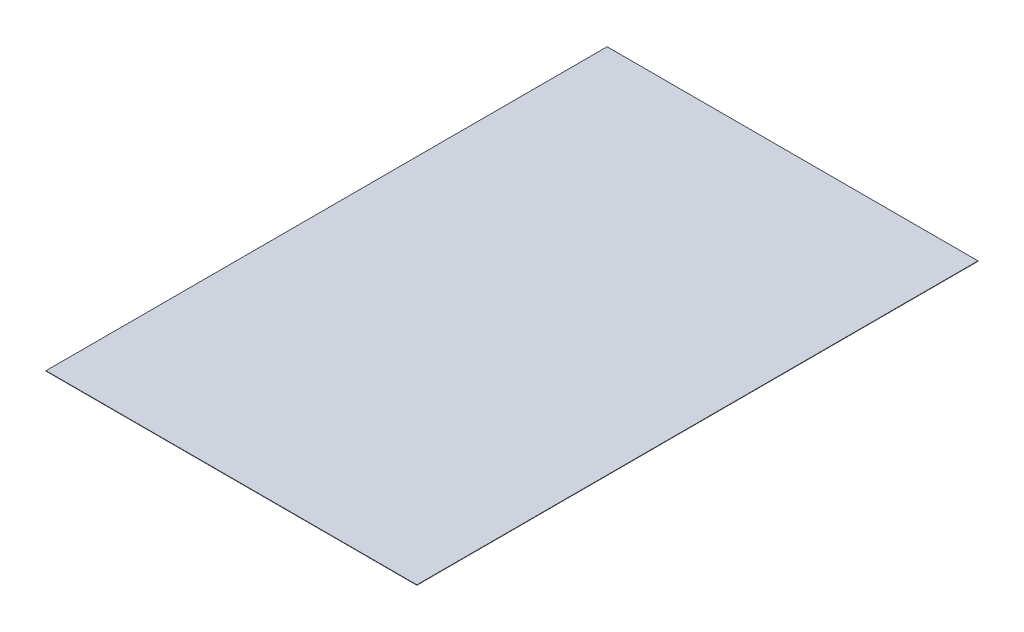
ISO-10303-21;
HEADER;
FILE_DESCRIPTION(('STEP AP214'),'2;1');
FILE_NAME('part.step','',(''),(''),'','','');
FILE_SCHEMA(('AUTOMOTIVE_DESIGN { 1 0 10303 214 1 1 1 1 }'));
ENDSEC;
DATA;
#1=APPLICATION_CONTEXT('core data for automotive mechanical design processes');
#2=APPLICATION_PROTOCOL_DEFINITION('international standard','automotive_design',2000,#1);
#3=PRODUCT_CONTEXT('',#1,'mechanical');
#4=PRODUCT('Part','Part','',(#3));
#5=PRODUCT_RELATED_PRODUCT_CATEGORY('part','',(#4));
#6=PRODUCT_DEFINITION_FORMATION('','',#4);
#7=PRODUCT_DEFINITION_CONTEXT('part definition',#1,'design');
#8=PRODUCT_DEFINITION('design','',#6,#7);
#9=PRODUCT_DEFINITION_SHAPE('','',#8);
#10=(LENGTH_UNIT() NAMED_UNIT(*) SI_UNIT(.MILLI.,.METRE.));
#11=(NAMED_UNIT(*) PLANE_ANGLE_UNIT() SI_UNIT($,.RADIAN.));
#12=(NAMED_UNIT(*) SI_UNIT($,.STERADIAN.) SOLID_ANGLE_UNIT());
#13=UNCERTAINTY_MEASURE_WITH_UNIT(LENGTH_MEASURE(1.E-05),#10,'distance_accuracy_value','');
#14=(GEOMETRIC_REPRESENTATION_CONTEXT(3) GLOBAL_UNCERTAINTY_ASSIGNED_CONTEXT((#13)) GLOBAL_UNIT_ASSIGNED_CONTEXT((#10,
#11,#12)) REPRESENTATION_CONTEXT('',''));
#15=CARTESIAN_POINT('',(0.,0.,0.));
#16=DIRECTION('',(0.,0.,1.));
#17=DIRECTION('',(1.,0.,0.));
#18=AXIS2_PLACEMENT_3D('',#15,#16,#17);
#19=CARTESIAN_POINT('',(-152.4,0.1016,152.4));
#20=DIRECTION('',(0.,-1.,0.));
#21=DIRECTION('',(0.,0.,-1.));
#22=AXIS2_PLACEMENT_3D('',#19,#20,#21);
#23=PLANE('',#22);
#24=DIRECTION('',(-1.,0.,0.));
#25=VECTOR('',#24,1.);
#26=CARTESIAN_POINT('',(-152.4,0.1016,152.4));
#27=LINE('',#26,#25);
#28=CARTESIAN_POINT('',(45.72,0.1016,152.4));
#29=VERTEX_POINT('',#28);
#30=CARTESIAN_POINT('',(-152.4,0.1016,152.4));
#31=VERTEX_POINT('',#30);
#32=EDGE_CURVE('E92',#29,#31,#27,.T.);
#33=ORIENTED_EDGE('',*,*,#32,.F.);
#34=DIRECTION('',(0.,0.,1.));
#35=VECTOR('',#34,1.);
#36=CARTESIAN_POINT('',(45.72,0.1016,-147.32));
#37=LINE('',#36,#35);
#38=CARTESIAN_POINT('',(45.72,0.1016,-147.32));
#39=VERTEX_POINT('',#38);
#40=EDGE_CURVE('E47',#39,#29,#37,.T.);
#41=ORIENTED_EDGE('',*,*,#40,.F.);
#42=DIRECTION('',(1.,0.,0.));
#43=VECTOR('',#42,1.);
#44=CARTESIAN_POINT('',(-152.4,0.1016,-147.32));
#45=LINE('',#44,#43);
#46=CARTESIAN_POINT('',(-152.4,0.1016,-147.32));
#47=VERTEX_POINT('',#46);
#48=EDGE_CURVE('E77',#47,#39,#45,.T.);
#49=ORIENTED_EDGE('',*,*,#48,.F.);
#50=DIRECTION('',(0.,0.,-1.));
#51=VECTOR('',#50,1.);
#52=CARTESIAN_POINT('',(-152.4,0.1016,152.4));
#53=LINE('',#52,#51);
#54=EDGE_CURVE('E11',#31,#47,#53,.T.);
#55=ORIENTED_EDGE('',*,*,#54,.F.);
#56=EDGE_LOOP('',(#33,#41,#49,#55));
#57=FACE_BOUND('',#56,.T.);
#58=ADVANCED_FACE('F33',(#57),#23,.F.);
#59=CARTESIAN_POINT('',(-152.4,-0.1016,152.4));
#60=DIRECTION('',(1.,0.,0.));
#61=DIRECTION('',(0.,0.,-1.));
#62=AXIS2_PLACEMENT_3D('',#59,#60,#61);
#63=PLANE('',#62);
#64=ORIENTED_EDGE('',*,*,#54,.T.);
#65=DIRECTION('',(0.,1.,0.));
#66=VECTOR('',#65,1.);
#67=CARTESIAN_POINT('',(-152.4,-0.1016,-147.32));
#68=LINE('',#67,#66);
#69=CARTESIAN_POINT('',(-152.4,-0.1016,-147.32));
#70=VERTEX_POINT('',#69);
#71=EDGE_CURVE('E74',#70,#47,#68,.T.);
#72=ORIENTED_EDGE('',*,*,#71,.F.);
#73=DIRECTION('',(0.,0.,-1.));
#74=VECTOR('',#73,1.);
#75=CARTESIAN_POINT('',(-152.4,-0.1016,152.4));
#76=LINE('',#75,#74);
#77=CARTESIAN_POINT('',(-152.4,-0.1016,152.4));
#78=VERTEX_POINT('',#77);
#79=EDGE_CURVE('E40',#78,#70,#76,.T.);
#80=ORIENTED_EDGE('',*,*,#79,.F.);
#81=DIRECTION('',(0.,-1.,0.));
#82=VECTOR('',#81,1.);
#83=CARTESIAN_POINT('',(-152.4,-0.1016,152.4));
#84=LINE('',#83,#82);
#85=EDGE_CURVE('E55',#31,#78,#84,.T.);
#86=ORIENTED_EDGE('',*,*,#85,.F.);
#87=EDGE_LOOP('',(#64,#72,#80,#86));
#88=FACE_BOUND('',#87,.T.);
#89=ADVANCED_FACE('F89',(#88),#63,.F.);
#90=CARTESIAN_POINT('',(-152.4,-0.1016,152.4));
#91=DIRECTION('',(0.,1.,0.));
#92=DIRECTION('',(0.,0.,1.));
#93=AXIS2_PLACEMENT_3D('',#90,#91,#92);
#94=PLANE('',#93);
#95=DIRECTION('',(1.,0.,0.));
#96=VECTOR('',#95,1.);
#97=CARTESIAN_POINT('',(-152.4,-0.1016,-147.32));
#98=LINE('',#97,#96);
#99=CARTESIAN_POINT('',(45.72,-0.1016,-147.32));
#100=VERTEX_POINT('',#99);
#101=EDGE_CURVE('E79',#70,#100,#98,.T.);
#102=ORIENTED_EDGE('',*,*,#101,.T.);
#103=DIRECTION('',(0.,0.,1.));
#104=VECTOR('',#103,1.);
#105=CARTESIAN_POINT('',(45.72,-0.1016,-147.32));
#106=LINE('',#105,#104);
#107=CARTESIAN_POINT('',(45.72,-0.1016,152.4));
#108=VERTEX_POINT('',#107);
#109=EDGE_CURVE('E83',#100,#108,#106,.T.);
#110=ORIENTED_EDGE('',*,*,#109,.T.);
#111=DIRECTION('',(1.,0.,0.));
#112=VECTOR('',#111,1.);
#113=CARTESIAN_POINT('',(-152.4,-0.1016,152.4));
#114=LINE('',#113,#112);
#115=EDGE_CURVE('E91',#78,#108,#114,.T.);
#116=ORIENTED_EDGE('',*,*,#115,.F.);
#117=ORIENTED_EDGE('',*,*,#79,.T.);
#118=EDGE_LOOP('',(#102,#110,#116,#117));
#119=FACE_BOUND('',#118,.T.);
#120=ADVANCED_FACE('F98',(#119),#94,.F.);
#121=CARTESIAN_POINT('',(0.,0.,152.4));
#122=DIRECTION('',(0.,0.,-1.));
#123=DIRECTION('',(-1.,0.,0.));
#124=AXIS2_PLACEMENT_3D('',#121,#122,#123);
#125=PLANE('',#124);
#126=ORIENTED_EDGE('',*,*,#115,.T.);
#127=DIRECTION('',(0.,1.,0.));
#128=VECTOR('',#127,1.);
#129=CARTESIAN_POINT('',(45.72,-0.1016,152.4));
#130=LINE('',#129,#128);
#131=EDGE_CURVE('E95',#108,#29,#130,.T.);
#132=ORIENTED_EDGE('',*,*,#131,.T.);
#133=ORIENTED_EDGE('',*,*,#32,.T.);
#134=ORIENTED_EDGE('',*,*,#85,.T.);
#135=EDGE_LOOP('',(#126,#132,#133,#134));
#136=FACE_BOUND('',#135,.T.);
#137=ADVANCED_FACE('F101',(#136),#125,.F.);
#138=CARTESIAN_POINT('',(45.72,-0.1016,-147.32));
#139=DIRECTION('',(-1.,0.,0.));
#140=DIRECTION('',(0.,0.,1.));
#141=AXIS2_PLACEMENT_3D('',#138,#139,#140);
#142=PLANE('',#141);
#143=ORIENTED_EDGE('',*,*,#131,.F.);
#144=ORIENTED_EDGE('',*,*,#109,.F.);
#145=DIRECTION('',(0.,1.,0.));
#146=VECTOR('',#145,1.);
#147=CARTESIAN_POINT('',(45.72,-0.1016,-147.32));
#148=LINE('',#147,#146);
#149=EDGE_CURVE('E82',#100,#39,#148,.T.);
#150=ORIENTED_EDGE('',*,*,#149,.T.);
#151=ORIENTED_EDGE('',*,*,#40,.T.);
#152=EDGE_LOOP('',(#143,#144,#150,#151));
#153=FACE_BOUND('',#152,.T.);
#154=ADVANCED_FACE('F107',(#153),#142,.F.);
#155=CARTESIAN_POINT('',(-152.4,-0.1016,-147.32));
#156=DIRECTION('',(0.,0.,1.));
#157=DIRECTION('',(1.,0.,0.));
#158=AXIS2_PLACEMENT_3D('',#155,#156,#157);
#159=PLANE('',#158);
#160=ORIENTED_EDGE('',*,*,#149,.F.);
#161=ORIENTED_EDGE('',*,*,#101,.F.);
#162=ORIENTED_EDGE('',*,*,#71,.T.);
#163=ORIENTED_EDGE('',*,*,#48,.T.);
#164=EDGE_LOOP('',(#160,#161,#162,#163));
#165=FACE_BOUND('',#164,.T.);
#166=ADVANCED_FACE('F76',(#165),#159,.F.);
#167=CLOSED_SHELL('',(#58,#89,#120,#137,#154,#166));
#168=MANIFOLD_SOLID_BREP('B2',#167);
#169=ADVANCED_BREP_SHAPE_REPRESENTATION('',(#18,#168),#14);
#170=SHAPE_DEFINITION_REPRESENTATION(#9,#169);
ENDSEC;
END-ISO-10303-21;
